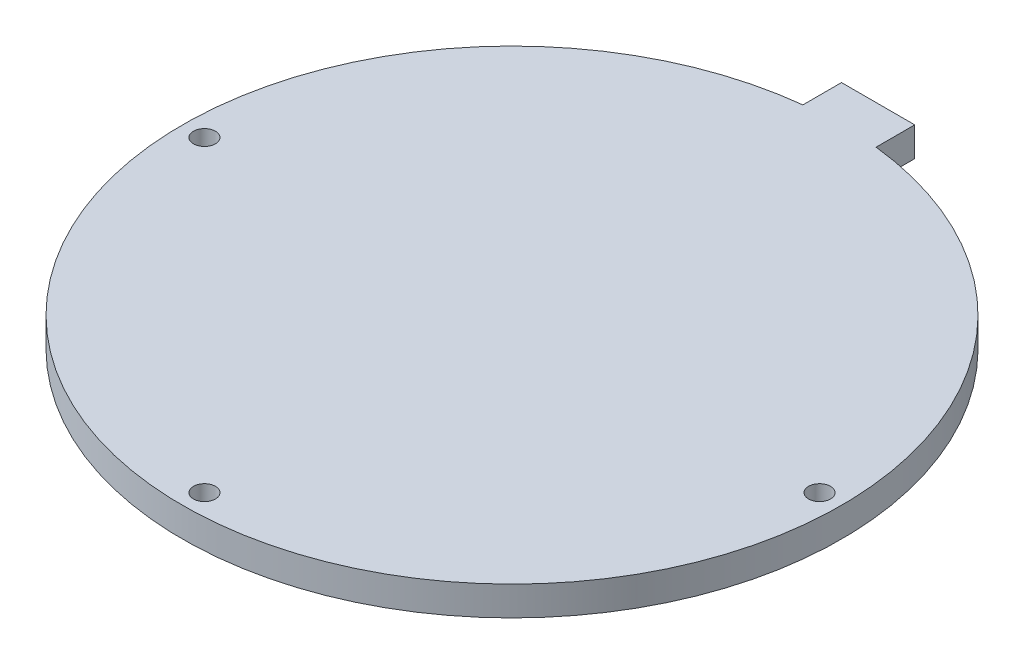
ISO-10303-21;
HEADER;
FILE_DESCRIPTION(('STEP AP214'),'2;1');
FILE_NAME('part.step','',(''),(''),'','','');
FILE_SCHEMA(('AUTOMOTIVE_DESIGN { 1 0 10303 214 1 1 1 1 }'));
ENDSEC;
DATA;
#1=APPLICATION_CONTEXT('core data for automotive mechanical design processes');
#2=APPLICATION_PROTOCOL_DEFINITION('international standard','automotive_design',2000,#1);
#3=PRODUCT_CONTEXT('',#1,'mechanical');
#4=PRODUCT('Part','Part','',(#3));
#5=PRODUCT_RELATED_PRODUCT_CATEGORY('part','',(#4));
#6=PRODUCT_DEFINITION_FORMATION('','',#4);
#7=PRODUCT_DEFINITION_CONTEXT('part definition',#1,'design');
#8=PRODUCT_DEFINITION('design','',#6,#7);
#9=PRODUCT_DEFINITION_SHAPE('','',#8);
#10=(LENGTH_UNIT() NAMED_UNIT(*) SI_UNIT(.MILLI.,.METRE.));
#11=(NAMED_UNIT(*) PLANE_ANGLE_UNIT() SI_UNIT($,.RADIAN.));
#12=(NAMED_UNIT(*) SI_UNIT($,.STERADIAN.) SOLID_ANGLE_UNIT());
#13=UNCERTAINTY_MEASURE_WITH_UNIT(LENGTH_MEASURE(1.E-05),#10,'distance_accuracy_value','');
#14=(GEOMETRIC_REPRESENTATION_CONTEXT(3) GLOBAL_UNCERTAINTY_ASSIGNED_CONTEXT((#13)) GLOBAL_UNIT_ASSIGNED_CONTEXT((#10,
#11,#12)) REPRESENTATION_CONTEXT('',''));
#15=CARTESIAN_POINT('',(0.,0.,0.));
#16=DIRECTION('',(0.,0.,1.));
#17=DIRECTION('',(1.,0.,0.));
#18=AXIS2_PLACEMENT_3D('',#15,#16,#17);
#19=CARTESIAN_POINT('',(0.,4.,0.));
#20=DIRECTION('',(0.,1.,0.));
#21=DIRECTION('',(0.,0.,1.));
#22=AXIS2_PLACEMENT_3D('',#19,#20,#21);
#23=PLANE('',#22);
#24=CARTESIAN_POINT('',(42.,4.,0.));
#25=DIRECTION('',(0.,1.,0.));
#26=DIRECTION('',(0.,0.,1.));
#27=AXIS2_PLACEMENT_3D('',#24,#25,#26);
#28=CIRCLE('',#27,1.5);
#29=CARTESIAN_POINT('',(42.,4.,1.5));
#30=VERTEX_POINT('',#29);
#31=EDGE_CURVE('E114',#30,#30,#28,.T.);
#32=ORIENTED_EDGE('',*,*,#31,.F.);
#33=EDGE_LOOP('',(#32));
#34=FACE_BOUND('',#33,.T.);
#35=CARTESIAN_POINT('',(0.,4.,0.));
#36=DIRECTION('',(0.,1.,0.));
#37=DIRECTION('',(0.,0.,1.));
#38=AXIS2_PLACEMENT_3D('',#35,#36,#37);
#39=CIRCLE('',#38,45.);
#40=CARTESIAN_POINT('',(-5.,4.,-44.7213595499958));
#41=VERTEX_POINT('',#40);
#42=CARTESIAN_POINT('',(5.,4.,-44.7213595499958));
#43=VERTEX_POINT('',#42);
#44=EDGE_CURVE('E84',#41,#43,#39,.T.);
#45=ORIENTED_EDGE('',*,*,#44,.T.);
#46=DIRECTION('',(0.,0.,-1.));
#47=VECTOR('',#46,1.);
#48=CARTESIAN_POINT('',(5.,4.,-50.));
#49=LINE('',#48,#47);
#50=CARTESIAN_POINT('',(5.,4.,-50.));
#51=VERTEX_POINT('',#50);
#52=EDGE_CURVE('E79',#43,#51,#49,.T.);
#53=ORIENTED_EDGE('',*,*,#52,.T.);
#54=DIRECTION('',(-1.,0.,0.));
#55=VECTOR('',#54,1.);
#56=CARTESIAN_POINT('',(-5.,4.,-50.));
#57=LINE('',#56,#55);
#58=CARTESIAN_POINT('',(-5.,4.,-50.));
#59=VERTEX_POINT('',#58);
#60=EDGE_CURVE('E82',#51,#59,#57,.T.);
#61=ORIENTED_EDGE('',*,*,#60,.T.);
#62=DIRECTION('',(0.,0.,1.));
#63=VECTOR('',#62,1.);
#64=CARTESIAN_POINT('',(-5.,4.,-50.));
#65=LINE('',#64,#63);
#66=EDGE_CURVE('E49',#59,#41,#65,.T.);
#67=ORIENTED_EDGE('',*,*,#66,.T.);
#68=EDGE_LOOP('',(#45,#53,#61,#67));
#69=FACE_BOUND('',#68,.T.);
#70=CARTESIAN_POINT('',(-42.,4.,0.));
#71=DIRECTION('',(0.,1.,0.));
#72=DIRECTION('',(0.,0.,1.));
#73=AXIS2_PLACEMENT_3D('',#70,#71,#72);
#74=CIRCLE('',#73,1.5);
#75=CARTESIAN_POINT('',(-42.,4.,1.5));
#76=VERTEX_POINT('',#75);
#77=EDGE_CURVE('E99',#76,#76,#74,.T.);
#78=ORIENTED_EDGE('',*,*,#77,.F.);
#79=EDGE_LOOP('',(#78));
#80=FACE_BOUND('',#79,.T.);
#81=CARTESIAN_POINT('',(0.,4.,42.));
#82=DIRECTION('',(0.,1.,0.));
#83=DIRECTION('',(0.,0.,1.));
#84=AXIS2_PLACEMENT_3D('',#81,#82,#83);
#85=CIRCLE('',#84,1.5);
#86=CARTESIAN_POINT('',(0.,4.,43.5));
#87=VERTEX_POINT('',#86);
#88=EDGE_CURVE('E120',#87,#87,#85,.T.);
#89=ORIENTED_EDGE('',*,*,#88,.F.);
#90=EDGE_LOOP('',(#89));
#91=FACE_BOUND('',#90,.T.);
#92=ADVANCED_FACE('F32',(#34,#69,#80,#91),#23,.T.);
#93=CARTESIAN_POINT('',(0.,0.,0.));
#94=DIRECTION('',(0.,1.,0.));
#95=DIRECTION('',(0.,0.,1.));
#96=AXIS2_PLACEMENT_3D('',#93,#94,#95);
#97=PLANE('',#96);
#98=CARTESIAN_POINT('',(0.,0.,0.));
#99=DIRECTION('',(0.,1.,0.));
#100=DIRECTION('',(0.,0.,1.));
#101=AXIS2_PLACEMENT_3D('',#98,#99,#100);
#102=CIRCLE('',#101,45.);
#103=CARTESIAN_POINT('',(-5.,0.,-44.7213595499958));
#104=VERTEX_POINT('',#103);
#105=CARTESIAN_POINT('',(5.,0.,-44.7213595499958));
#106=VERTEX_POINT('',#105);
#107=EDGE_CURVE('E96',#104,#106,#102,.T.);
#108=ORIENTED_EDGE('',*,*,#107,.F.);
#109=DIRECTION('',(0.,0.,1.));
#110=VECTOR('',#109,1.);
#111=CARTESIAN_POINT('',(-5.,0.,-50.));
#112=LINE('',#111,#110);
#113=CARTESIAN_POINT('',(-5.,0.,-50.));
#114=VERTEX_POINT('',#113);
#115=EDGE_CURVE('E72',#114,#104,#112,.T.);
#116=ORIENTED_EDGE('',*,*,#115,.F.);
#117=DIRECTION('',(-1.,0.,0.));
#118=VECTOR('',#117,1.);
#119=CARTESIAN_POINT('',(-5.,0.,-50.));
#120=LINE('',#119,#118);
#121=CARTESIAN_POINT('',(5.,0.,-50.));
#122=VERTEX_POINT('',#121);
#123=EDGE_CURVE('E66',#122,#114,#120,.T.);
#124=ORIENTED_EDGE('',*,*,#123,.F.);
#125=DIRECTION('',(0.,0.,-1.));
#126=VECTOR('',#125,1.);
#127=CARTESIAN_POINT('',(5.,0.,-50.));
#128=LINE('',#127,#126);
#129=EDGE_CURVE('E88',#106,#122,#128,.T.);
#130=ORIENTED_EDGE('',*,*,#129,.F.);
#131=EDGE_LOOP('',(#108,#116,#124,#130));
#132=FACE_BOUND('',#131,.T.);
#133=CARTESIAN_POINT('',(-42.,0.,0.));
#134=DIRECTION('',(0.,1.,0.));
#135=DIRECTION('',(0.,0.,1.));
#136=AXIS2_PLACEMENT_3D('',#133,#134,#135);
#137=CIRCLE('',#136,1.5);
#138=CARTESIAN_POINT('',(-42.,0.,1.5));
#139=VERTEX_POINT('',#138);
#140=EDGE_CURVE('E111',#139,#139,#137,.T.);
#141=ORIENTED_EDGE('',*,*,#140,.T.);
#142=EDGE_LOOP('',(#141));
#143=FACE_BOUND('',#142,.T.);
#144=CARTESIAN_POINT('',(42.,0.,0.));
#145=DIRECTION('',(0.,1.,0.));
#146=DIRECTION('',(0.,0.,1.));
#147=AXIS2_PLACEMENT_3D('',#144,#145,#146);
#148=CIRCLE('',#147,1.5);
#149=CARTESIAN_POINT('',(42.,0.,1.5));
#150=VERTEX_POINT('',#149);
#151=EDGE_CURVE('E117',#150,#150,#148,.T.);
#152=ORIENTED_EDGE('',*,*,#151,.T.);
#153=EDGE_LOOP('',(#152));
#154=FACE_BOUND('',#153,.T.);
#155=CARTESIAN_POINT('',(0.,0.,42.));
#156=DIRECTION('',(0.,1.,0.));
#157=DIRECTION('',(0.,0.,1.));
#158=AXIS2_PLACEMENT_3D('',#155,#156,#157);
#159=CIRCLE('',#158,1.5);
#160=CARTESIAN_POINT('',(0.,0.,43.5));
#161=VERTEX_POINT('',#160);
#162=EDGE_CURVE('E123',#161,#161,#159,.T.);
#163=ORIENTED_EDGE('',*,*,#162,.T.);
#164=EDGE_LOOP('',(#163));
#165=FACE_BOUND('',#164,.T.);
#166=ADVANCED_FACE('F107',(#132,#143,#154,#165),#97,.F.);
#167=CARTESIAN_POINT('',(0.,4.,0.));
#168=DIRECTION('',(0.,-1.,0.));
#169=DIRECTION('',(0.,0.,-1.));
#170=AXIS2_PLACEMENT_3D('',#167,#168,#169);
#171=CYLINDRICAL_SURFACE('',#170,45.);
#172=ORIENTED_EDGE('',*,*,#107,.T.);
#173=DIRECTION('',(0.,-1.,0.));
#174=VECTOR('',#173,1.);
#175=CARTESIAN_POINT('',(5.,4.,-44.7213595499958));
#176=LINE('',#175,#174);
#177=EDGE_CURVE('E11',#43,#106,#176,.T.);
#178=ORIENTED_EDGE('',*,*,#177,.F.);
#179=ORIENTED_EDGE('',*,*,#44,.F.);
#180=DIRECTION('',(0.,-1.,0.));
#181=VECTOR('',#180,1.);
#182=CARTESIAN_POINT('',(-5.,4.,-44.7213595499958));
#183=LINE('',#182,#181);
#184=EDGE_CURVE('E92',#41,#104,#183,.T.);
#185=ORIENTED_EDGE('',*,*,#184,.T.);
#186=EDGE_LOOP('',(#172,#178,#179,#185));
#187=FACE_BOUND('',#186,.T.);
#188=ADVANCED_FACE('F34',(#187),#171,.T.);
#189=CARTESIAN_POINT('',(5.,4.,-50.));
#190=DIRECTION('',(-1.,0.,0.));
#191=DIRECTION('',(0.,0.,1.));
#192=AXIS2_PLACEMENT_3D('',#189,#190,#191);
#193=PLANE('',#192);
#194=ORIENTED_EDGE('',*,*,#129,.T.);
#195=DIRECTION('',(0.,-1.,0.));
#196=VECTOR('',#195,1.);
#197=CARTESIAN_POINT('',(5.,4.,-50.));
#198=LINE('',#197,#196);
#199=EDGE_CURVE('E41',#51,#122,#198,.T.);
#200=ORIENTED_EDGE('',*,*,#199,.F.);
#201=ORIENTED_EDGE('',*,*,#52,.F.);
#202=ORIENTED_EDGE('',*,*,#177,.T.);
#203=EDGE_LOOP('',(#194,#200,#201,#202));
#204=FACE_BOUND('',#203,.T.);
#205=ADVANCED_FACE('F87',(#204),#193,.F.);
#206=CARTESIAN_POINT('',(-5.,4.,-50.));
#207=DIRECTION('',(0.,0.,1.));
#208=DIRECTION('',(1.,0.,0.));
#209=AXIS2_PLACEMENT_3D('',#206,#207,#208);
#210=PLANE('',#209);
#211=ORIENTED_EDGE('',*,*,#123,.T.);
#212=DIRECTION('',(0.,-1.,0.));
#213=VECTOR('',#212,1.);
#214=CARTESIAN_POINT('',(-5.,4.,-50.));
#215=LINE('',#214,#213);
#216=EDGE_CURVE('E89',#59,#114,#215,.T.);
#217=ORIENTED_EDGE('',*,*,#216,.F.);
#218=ORIENTED_EDGE('',*,*,#60,.F.);
#219=ORIENTED_EDGE('',*,*,#199,.T.);
#220=EDGE_LOOP('',(#211,#217,#218,#219));
#221=FACE_BOUND('',#220,.T.);
#222=ADVANCED_FACE('F90',(#221),#210,.F.);
#223=CARTESIAN_POINT('',(-5.,4.,-50.));
#224=DIRECTION('',(1.,0.,0.));
#225=DIRECTION('',(0.,0.,-1.));
#226=AXIS2_PLACEMENT_3D('',#223,#224,#225);
#227=PLANE('',#226);
#228=ORIENTED_EDGE('',*,*,#115,.T.);
#229=ORIENTED_EDGE('',*,*,#184,.F.);
#230=ORIENTED_EDGE('',*,*,#66,.F.);
#231=ORIENTED_EDGE('',*,*,#216,.T.);
#232=EDGE_LOOP('',(#228,#229,#230,#231));
#233=FACE_BOUND('',#232,.T.);
#234=ADVANCED_FACE('F104',(#233),#227,.F.);
#235=CARTESIAN_POINT('',(-42.,4.,0.));
#236=DIRECTION('',(0.,-1.,0.));
#237=DIRECTION('',(0.,0.,-1.));
#238=AXIS2_PLACEMENT_3D('',#235,#236,#237);
#239=CYLINDRICAL_SURFACE('',#238,1.5);
#240=ORIENTED_EDGE('',*,*,#77,.T.);
#241=EDGE_LOOP('',(#240));
#242=FACE_BOUND('',#241,.T.);
#243=ORIENTED_EDGE('',*,*,#140,.F.);
#244=EDGE_LOOP('',(#243));
#245=FACE_BOUND('',#244,.T.);
#246=ADVANCED_FACE('F141',(#242,#245),#239,.F.);
#247=CARTESIAN_POINT('',(42.,4.,0.));
#248=DIRECTION('',(0.,-1.,0.));
#249=DIRECTION('',(0.,0.,-1.));
#250=AXIS2_PLACEMENT_3D('',#247,#248,#249);
#251=CYLINDRICAL_SURFACE('',#250,1.5);
#252=ORIENTED_EDGE('',*,*,#31,.T.);
#253=EDGE_LOOP('',(#252));
#254=FACE_BOUND('',#253,.T.);
#255=ORIENTED_EDGE('',*,*,#151,.F.);
#256=EDGE_LOOP('',(#255));
#257=FACE_BOUND('',#256,.T.);
#258=ADVANCED_FACE('F187',(#254,#257),#251,.F.);
#259=CARTESIAN_POINT('',(0.,4.,42.));
#260=DIRECTION('',(0.,-1.,0.));
#261=DIRECTION('',(0.,0.,-1.));
#262=AXIS2_PLACEMENT_3D('',#259,#260,#261);
#263=CYLINDRICAL_SURFACE('',#262,1.5);
#264=ORIENTED_EDGE('',*,*,#88,.T.);
#265=EDGE_LOOP('',(#264));
#266=FACE_BOUND('',#265,.T.);
#267=ORIENTED_EDGE('',*,*,#162,.F.);
#268=EDGE_LOOP('',(#267));
#269=FACE_BOUND('',#268,.T.);
#270=ADVANCED_FACE('F129',(#266,#269),#263,.F.);
#271=CLOSED_SHELL('',(#92,#166,#188,#205,#222,#234,#246,#258,#270));
#272=MANIFOLD_SOLID_BREP('B2',#271);
#273=ADVANCED_BREP_SHAPE_REPRESENTATION('',(#18,#272),#14);
#274=SHAPE_DEFINITION_REPRESENTATION(#9,#273);
ENDSEC;
END-ISO-10303-21;
